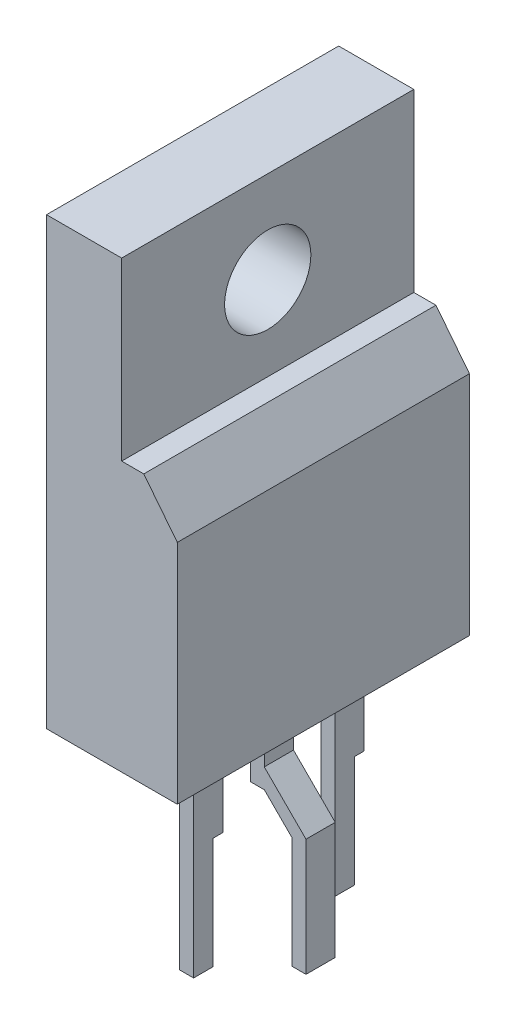
ISO-10303-21;
HEADER;
FILE_DESCRIPTION(('STEP AP214'),'2;1');
FILE_NAME('part.step','',(''),(''),'','','');
FILE_SCHEMA(('AUTOMOTIVE_DESIGN { 1 0 10303 214 1 1 1 1 }'));
ENDSEC;
DATA;
#1=APPLICATION_CONTEXT('core data for automotive mechanical design processes');
#2=APPLICATION_PROTOCOL_DEFINITION('international standard','automotive_design',2000,#1);
#3=PRODUCT_CONTEXT('',#1,'mechanical');
#4=PRODUCT('Part','Part','',(#3));
#5=PRODUCT_RELATED_PRODUCT_CATEGORY('part','',(#4));
#6=PRODUCT_DEFINITION_FORMATION('','',#4);
#7=PRODUCT_DEFINITION_CONTEXT('part definition',#1,'design');
#8=PRODUCT_DEFINITION('design','',#6,#7);
#9=PRODUCT_DEFINITION_SHAPE('','',#8);
#10=(LENGTH_UNIT() NAMED_UNIT(*) SI_UNIT(.MILLI.,.METRE.));
#11=(NAMED_UNIT(*) PLANE_ANGLE_UNIT() SI_UNIT($,.RADIAN.));
#12=(NAMED_UNIT(*) SI_UNIT($,.STERADIAN.) SOLID_ANGLE_UNIT());
#13=UNCERTAINTY_MEASURE_WITH_UNIT(LENGTH_MEASURE(1.E-05),#10,'distance_accuracy_value','');
#14=(GEOMETRIC_REPRESENTATION_CONTEXT(3) GLOBAL_UNCERTAINTY_ASSIGNED_CONTEXT((#13)) GLOBAL_UNIT_ASSIGNED_CONTEXT((#10,
#11,#12)) REPRESENTATION_CONTEXT('',''));
#15=CARTESIAN_POINT('',(0.,0.,0.));
#16=DIRECTION('',(0.,0.,1.));
#17=DIRECTION('',(1.,0.,0.));
#18=AXIS2_PLACEMENT_3D('',#15,#16,#17);
#19=CARTESIAN_POINT('',(3.1,0.,0.));
#20=DIRECTION('',(-1.,0.,0.));
#21=DIRECTION('',(0.,0.,1.));
#22=AXIS2_PLACEMENT_3D('',#19,#20,#21);
#23=PLANE('',#22);
#24=DIRECTION('',(0.,0.,-1.));
#25=VECTOR('',#24,1.);
#26=CARTESIAN_POINT('',(3.1,-23.3,2.53));
#27=LINE('',#26,#25);
#28=CARTESIAN_POINT('',(3.1,-23.3,2.53));
#29=VERTEX_POINT('',#28);
#30=CARTESIAN_POINT('',(3.1,-23.3,3.235));
#31=VERTEX_POINT('',#30);
#32=EDGE_CURVE('E303',#29,#31,#27,.F.);
#33=ORIENTED_EDGE('',*,*,#32,.F.);
#34=DIRECTION('',(0.,1.,0.));
#35=VECTOR('',#34,1.);
#36=CARTESIAN_POINT('',(3.1,-19.3,2.53));
#37=LINE('',#36,#35);
#38=CARTESIAN_POINT('',(3.1,-19.3,2.53));
#39=VERTEX_POINT('',#38);
#40=EDGE_CURVE('E308',#39,#29,#37,.F.);
#41=ORIENTED_EDGE('',*,*,#40,.F.);
#42=DIRECTION('',(0.,0.,-1.));
#43=VECTOR('',#42,1.);
#44=CARTESIAN_POINT('',(3.1,-19.3,2.185));
#45=LINE('',#44,#43);
#46=CARTESIAN_POINT('',(3.1,-19.3,2.185));
#47=VERTEX_POINT('',#46);
#48=EDGE_CURVE('E224',#47,#39,#45,.F.);
#49=ORIENTED_EDGE('',*,*,#48,.F.);
#50=DIRECTION('',(0.,1.,0.));
#51=VECTOR('',#50,1.);
#52=CARTESIAN_POINT('',(3.1,-16.,2.185));
#53=LINE('',#52,#51);
#54=CARTESIAN_POINT('',(3.1,-16.,2.185));
#55=VERTEX_POINT('',#54);
#56=EDGE_CURVE('E205',#55,#47,#53,.F.);
#57=ORIENTED_EDGE('',*,*,#56,.F.);
#58=DIRECTION('',(0.,0.,1.));
#59=VECTOR('',#58,1.);
#60=CARTESIAN_POINT('',(3.1,-16.,0.));
#61=LINE('',#60,#59);
#62=CARTESIAN_POINT('',(3.1,-16.,3.235));
#63=VERTEX_POINT('',#62);
#64=EDGE_CURVE('E210',#63,#55,#61,.F.);
#65=ORIENTED_EDGE('',*,*,#64,.F.);
#66=DIRECTION('',(0.,1.,0.));
#67=VECTOR('',#66,1.);
#68=CARTESIAN_POINT('',(3.1,-23.3,3.235));
#69=LINE('',#68,#67);
#70=EDGE_CURVE('E298',#31,#63,#69,.T.);
#71=ORIENTED_EDGE('',*,*,#70,.F.);
#72=EDGE_LOOP('',(#33,#41,#49,#57,#65,#71));
#73=FACE_BOUND('',#72,.T.);
#74=ADVANCED_FACE('F17',(#73),#23,.F.);
#75=CARTESIAN_POINT('',(3.1,0.,0.));
#76=DIRECTION('',(-1.,0.,0.));
#77=DIRECTION('',(0.,0.,1.));
#78=AXIS2_PLACEMENT_3D('',#75,#76,#77);
#79=PLANE('',#78);
#80=DIRECTION('',(0.,0.,1.));
#81=VECTOR('',#80,1.);
#82=CARTESIAN_POINT('',(3.1,-16.,0.));
#83=LINE('',#82,#81);
#84=CARTESIAN_POINT('',(3.1,-16.,5.775));
#85=VERTEX_POINT('',#84);
#86=CARTESIAN_POINT('',(3.1,-16.,4.725));
#87=VERTEX_POINT('',#86);
#88=EDGE_CURVE('E220',#85,#87,#83,.F.);
#89=ORIENTED_EDGE('',*,*,#88,.F.);
#90=DIRECTION('',(0.,1.,0.));
#91=VECTOR('',#90,1.);
#92=CARTESIAN_POINT('',(3.1,-23.3,5.775));
#93=LINE('',#92,#91);
#94=CARTESIAN_POINT('',(3.10000000000005,-17.9999999999999,5.775));
#95=VERTEX_POINT('',#94);
#96=EDGE_CURVE('E274',#95,#85,#93,.T.);
#97=ORIENTED_EDGE('',*,*,#96,.F.);
#98=DIRECTION('',(0.,0.,1.));
#99=VECTOR('',#98,1.);
#100=CARTESIAN_POINT('',(3.10000000000011,-17.9999999999999,5.775));
#101=LINE('',#100,#99);
#102=CARTESIAN_POINT('',(3.10000000000003,-18.,4.725));
#103=VERTEX_POINT('',#102);
#104=EDGE_CURVE('E248',#103,#95,#101,.T.);
#105=ORIENTED_EDGE('',*,*,#104,.F.);
#106=DIRECTION('',(0.,1.,0.));
#107=VECTOR('',#106,1.);
#108=CARTESIAN_POINT('',(3.1,-16.,4.725));
#109=LINE('',#108,#107);
#110=EDGE_CURVE('E262',#87,#103,#109,.F.);
#111=ORIENTED_EDGE('',*,*,#110,.F.);
#112=EDGE_LOOP('',(#89,#97,#105,#111));
#113=FACE_BOUND('',#112,.T.);
#114=ADVANCED_FACE('F263',(#113),#79,.F.);
#115=CARTESIAN_POINT('',(4.6,-19.5,5.775));
#116=DIRECTION('',(0.707106781186598,0.707106781186498,0.));
#117=DIRECTION('',(-0.707106781186498,0.707106781186598,0.));
#118=AXIS2_PLACEMENT_3D('',#115,#116,#117);
#119=PLANE('',#118);
#120=DIRECTION('',(0.707106781186548,-0.707106781186547,0.));
#121=VECTOR('',#120,1.);
#122=CARTESIAN_POINT('',(3.1,-18.,4.725));
#123=LINE('',#122,#121);
#124=CARTESIAN_POINT('',(4.6,-19.5,4.725));
#125=VERTEX_POINT('',#124);
#126=EDGE_CURVE('E267',#103,#125,#123,.T.);
#127=ORIENTED_EDGE('',*,*,#126,.F.);
#128=ORIENTED_EDGE('',*,*,#104,.T.);
#129=DIRECTION('',(-0.707106781186548,0.707106781186547,0.));
#130=VECTOR('',#129,1.);
#131=CARTESIAN_POINT('',(4.6,-19.5,5.775));
#132=LINE('',#131,#130);
#133=CARTESIAN_POINT('',(4.6,-19.5,5.775));
#134=VERTEX_POINT('',#133);
#135=EDGE_CURVE('E279',#134,#95,#132,.T.);
#136=ORIENTED_EDGE('',*,*,#135,.F.);
#137=DIRECTION('',(0.,0.,-1.));
#138=VECTOR('',#137,1.);
#139=CARTESIAN_POINT('',(4.6,-19.5,5.775));
#140=LINE('',#139,#138);
#141=EDGE_CURVE('E246',#125,#134,#140,.F.);
#142=ORIENTED_EDGE('',*,*,#141,.F.);
#143=EDGE_LOOP('',(#127,#128,#136,#142));
#144=FACE_BOUND('',#143,.T.);
#145=ADVANCED_FACE('F389',(#144),#119,.T.);
#146=CARTESIAN_POINT('',(4.6,-23.70710678119,5.775));
#147=DIRECTION('',(1.,0.,0.));
#148=DIRECTION('',(0.,0.,-1.));
#149=AXIS2_PLACEMENT_3D('',#146,#147,#148);
#150=PLANE('',#149);
#151=ORIENTED_EDGE('',*,*,#141,.T.);
#152=DIRECTION('',(0.,1.,0.));
#153=VECTOR('',#152,1.);
#154=CARTESIAN_POINT('',(4.6,-23.3,5.775));
#155=LINE('',#154,#153);
#156=CARTESIAN_POINT('',(4.6,-23.70710678119,5.775));
#157=VERTEX_POINT('',#156);
#158=EDGE_CURVE('E282',#157,#134,#155,.T.);
#159=ORIENTED_EDGE('',*,*,#158,.F.);
#160=DIRECTION('',(0.,0.,-1.));
#161=VECTOR('',#160,1.);
#162=CARTESIAN_POINT('',(4.6,-23.70710678119,5.775));
#163=LINE('',#162,#161);
#164=CARTESIAN_POINT('',(4.6,-23.70710678119,4.725));
#165=VERTEX_POINT('',#164);
#166=EDGE_CURVE('E244',#165,#157,#163,.F.);
#167=ORIENTED_EDGE('',*,*,#166,.F.);
#168=DIRECTION('',(0.,1.,0.));
#169=VECTOR('',#168,1.);
#170=CARTESIAN_POINT('',(4.6,-16.,4.725));
#171=LINE('',#170,#169);
#172=EDGE_CURVE('E385',#125,#165,#171,.F.);
#173=ORIENTED_EDGE('',*,*,#172,.F.);
#174=EDGE_LOOP('',(#151,#159,#167,#173));
#175=FACE_BOUND('',#174,.T.);
#176=ADVANCED_FACE('F393',(#175),#150,.T.);
#177=CARTESIAN_POINT('',(4.1,-23.70710678119,5.775));
#178=DIRECTION('',(0.,-1.,0.));
#179=DIRECTION('',(0.,0.,-1.));
#180=AXIS2_PLACEMENT_3D('',#177,#178,#179);
#181=PLANE('',#180);
#182=ORIENTED_EDGE('',*,*,#166,.T.);
#183=DIRECTION('',(1.,0.,0.));
#184=VECTOR('',#183,1.);
#185=CARTESIAN_POINT('',(2.6,-23.70710678119,5.775));
#186=LINE('',#185,#184);
#187=CARTESIAN_POINT('',(4.1,-23.70710678119,5.775));
#188=VERTEX_POINT('',#187);
#189=EDGE_CURVE('E285',#188,#157,#186,.T.);
#190=ORIENTED_EDGE('',*,*,#189,.F.);
#191=DIRECTION('',(0.,0.,1.));
#192=VECTOR('',#191,1.);
#193=CARTESIAN_POINT('',(4.1,-23.70710678119,5.775));
#194=LINE('',#193,#192);
#195=CARTESIAN_POINT('',(4.1,-23.70710678119,4.725));
#196=VERTEX_POINT('',#195);
#197=EDGE_CURVE('E242',#196,#188,#194,.T.);
#198=ORIENTED_EDGE('',*,*,#197,.F.);
#199=DIRECTION('',(-1.,0.,0.));
#200=VECTOR('',#199,1.);
#201=CARTESIAN_POINT('',(2.6,-23.70710678119,4.725));
#202=LINE('',#201,#200);
#203=EDGE_CURVE('E382',#165,#196,#202,.T.);
#204=ORIENTED_EDGE('',*,*,#203,.F.);
#205=EDGE_LOOP('',(#182,#190,#198,#204));
#206=FACE_BOUND('',#205,.T.);
#207=ADVANCED_FACE('F397',(#206),#181,.T.);
#208=CARTESIAN_POINT('',(4.1,-19.70710678119,5.775));
#209=DIRECTION('',(-1.,0.,0.));
#210=DIRECTION('',(0.,0.,1.));
#211=AXIS2_PLACEMENT_3D('',#208,#209,#210);
#212=PLANE('',#211);
#213=ORIENTED_EDGE('',*,*,#197,.T.);
#214=DIRECTION('',(0.,1.,0.));
#215=VECTOR('',#214,1.);
#216=CARTESIAN_POINT('',(4.1,-23.3,5.775));
#217=LINE('',#216,#215);
#218=CARTESIAN_POINT('',(4.09999999999995,-19.7071067811901,5.775));
#219=VERTEX_POINT('',#218);
#220=EDGE_CURVE('E288',#219,#188,#217,.F.);
#221=ORIENTED_EDGE('',*,*,#220,.F.);
#222=DIRECTION('',(0.,0.,1.));
#223=VECTOR('',#222,1.);
#224=CARTESIAN_POINT('',(4.09999999999989,-19.7071067811901,5.775));
#225=LINE('',#224,#223);
#226=CARTESIAN_POINT('',(4.09999999999997,-19.70710678119,4.725));
#227=VERTEX_POINT('',#226);
#228=EDGE_CURVE('E240',#227,#219,#225,.T.);
#229=ORIENTED_EDGE('',*,*,#228,.F.);
#230=DIRECTION('',(0.,1.,0.));
#231=VECTOR('',#230,1.);
#232=CARTESIAN_POINT('',(4.1,-16.,4.725));
#233=LINE('',#232,#231);
#234=EDGE_CURVE('E379',#196,#227,#233,.T.);
#235=ORIENTED_EDGE('',*,*,#234,.F.);
#236=EDGE_LOOP('',(#213,#221,#229,#235));
#237=FACE_BOUND('',#236,.T.);
#238=ADVANCED_FACE('F401',(#237),#212,.T.);
#239=CARTESIAN_POINT('',(2.6,-18.20710678119,5.775));
#240=DIRECTION('',(-0.707106781186598,-0.707106781186498,0.));
#241=DIRECTION('',(0.707106781186498,-0.707106781186598,0.));
#242=AXIS2_PLACEMENT_3D('',#239,#240,#241);
#243=PLANE('',#242);
#244=DIRECTION('',(0.707106781186547,-0.707106781186548,0.));
#245=VECTOR('',#244,1.);
#246=CARTESIAN_POINT('',(3.1,-18.70710678119,5.775));
#247=LINE('',#246,#245);
#248=CARTESIAN_POINT('',(3.09999999999999,-18.70710678119,5.775));
#249=VERTEX_POINT('',#248);
#250=EDGE_CURVE('E291',#249,#219,#247,.T.);
#251=ORIENTED_EDGE('',*,*,#250,.F.);
#252=DIRECTION('',(0.,0.,1.));
#253=VECTOR('',#252,1.);
#254=CARTESIAN_POINT('',(3.1,-18.70710678119,0.));
#255=LINE('',#254,#253);
#256=CARTESIAN_POINT('',(3.09999999999998,-18.70710678119,4.725));
#257=VERTEX_POINT('',#256);
#258=EDGE_CURVE('E238',#249,#257,#255,.F.);
#259=ORIENTED_EDGE('',*,*,#258,.T.);
#260=DIRECTION('',(-0.707106781186547,0.707106781186548,0.));
#261=VECTOR('',#260,1.);
#262=CARTESIAN_POINT('',(4.1,-19.70710678119,4.725));
#263=LINE('',#262,#261);
#264=EDGE_CURVE('E376',#227,#257,#263,.T.);
#265=ORIENTED_EDGE('',*,*,#264,.F.);
#266=ORIENTED_EDGE('',*,*,#228,.T.);
#267=EDGE_LOOP('',(#251,#259,#265,#266));
#268=FACE_BOUND('',#267,.T.);
#269=ADVANCED_FACE('F405',(#268),#243,.T.);
#270=CARTESIAN_POINT('',(3.1,0.,0.));
#271=DIRECTION('',(-1.,0.,0.));
#272=DIRECTION('',(0.,0.,1.));
#273=AXIS2_PLACEMENT_3D('',#270,#271,#272);
#274=PLANE('',#273);
#275=ORIENTED_EDGE('',*,*,#258,.F.);
#276=DIRECTION('',(0.,1.,0.));
#277=VECTOR('',#276,1.);
#278=CARTESIAN_POINT('',(3.1,-23.3,5.775));
#279=LINE('',#278,#277);
#280=CARTESIAN_POINT('',(3.1,-18.71,5.775));
#281=VERTEX_POINT('',#280);
#282=EDGE_CURVE('E294',#281,#249,#279,.T.);
#283=ORIENTED_EDGE('',*,*,#282,.F.);
#284=DIRECTION('',(0.,0.,-1.));
#285=VECTOR('',#284,1.);
#286=CARTESIAN_POINT('',(3.1,-18.71,0.));
#287=LINE('',#286,#285);
#288=CARTESIAN_POINT('',(3.1,-18.71,4.725));
#289=VERTEX_POINT('',#288);
#290=EDGE_CURVE('E365',#289,#281,#287,.F.);
#291=ORIENTED_EDGE('',*,*,#290,.F.);
#292=DIRECTION('',(0.,1.,0.));
#293=VECTOR('',#292,1.);
#294=CARTESIAN_POINT('',(3.1,-16.,4.725));
#295=LINE('',#294,#293);
#296=EDGE_CURVE('E374',#257,#289,#295,.F.);
#297=ORIENTED_EDGE('',*,*,#296,.F.);
#298=EDGE_LOOP('',(#275,#283,#291,#297));
#299=FACE_BOUND('',#298,.T.);
#300=ADVANCED_FACE('F409',(#299),#274,.F.);
#301=CARTESIAN_POINT('',(3.1,0.,0.));
#302=DIRECTION('',(-1.,0.,0.));
#303=DIRECTION('',(0.,0.,1.));
#304=AXIS2_PLACEMENT_3D('',#301,#302,#303);
#305=PLANE('',#304);
#306=DIRECTION('',(0.,0.,-1.));
#307=VECTOR('',#306,1.);
#308=CARTESIAN_POINT('',(3.1,-23.3,7.61));
#309=LINE('',#308,#307);
#310=CARTESIAN_POINT('',(3.1,-23.3,7.61));
#311=VERTEX_POINT('',#310);
#312=CARTESIAN_POINT('',(3.1,-23.3,8.315));
#313=VERTEX_POINT('',#312);
#314=EDGE_CURVE('E345',#311,#313,#309,.F.);
#315=ORIENTED_EDGE('',*,*,#314,.F.);
#316=DIRECTION('',(0.,1.,0.));
#317=VECTOR('',#316,1.);
#318=CARTESIAN_POINT('',(3.1,-19.3,7.61));
#319=LINE('',#318,#317);
#320=CARTESIAN_POINT('',(3.1,-19.3,7.61));
#321=VERTEX_POINT('',#320);
#322=EDGE_CURVE('E350',#321,#311,#319,.F.);
#323=ORIENTED_EDGE('',*,*,#322,.F.);
#324=DIRECTION('',(0.,0.,-1.));
#325=VECTOR('',#324,1.);
#326=CARTESIAN_POINT('',(3.1,-19.3,7.265));
#327=LINE('',#326,#325);
#328=CARTESIAN_POINT('',(3.1,-19.3,7.265));
#329=VERTEX_POINT('',#328);
#330=EDGE_CURVE('E355',#329,#321,#327,.F.);
#331=ORIENTED_EDGE('',*,*,#330,.F.);
#332=DIRECTION('',(0.,1.,0.));
#333=VECTOR('',#332,1.);
#334=CARTESIAN_POINT('',(3.1,-16.,7.265));
#335=LINE('',#334,#333);
#336=CARTESIAN_POINT('',(3.1,-16.,7.265));
#337=VERTEX_POINT('',#336);
#338=EDGE_CURVE('E363',#337,#329,#335,.F.);
#339=ORIENTED_EDGE('',*,*,#338,.F.);
#340=DIRECTION('',(0.,0.,1.));
#341=VECTOR('',#340,1.);
#342=CARTESIAN_POINT('',(3.1,-16.,0.));
#343=LINE('',#342,#341);
#344=CARTESIAN_POINT('',(3.1,-16.,8.315));
#345=VERTEX_POINT('',#344);
#346=EDGE_CURVE('E226',#345,#337,#343,.F.);
#347=ORIENTED_EDGE('',*,*,#346,.F.);
#348=DIRECTION('',(0.,1.,0.));
#349=VECTOR('',#348,1.);
#350=CARTESIAN_POINT('',(3.1,-23.3,8.315));
#351=LINE('',#350,#349);
#352=EDGE_CURVE('E339',#313,#345,#351,.T.);
#353=ORIENTED_EDGE('',*,*,#352,.F.);
#354=EDGE_LOOP('',(#315,#323,#331,#339,#347,#353));
#355=FACE_BOUND('',#354,.T.);
#356=ADVANCED_FACE('F677',(#355),#305,.F.);
#357=CARTESIAN_POINT('',(2.6,-16.,2.185));
#358=DIRECTION('',(0.,0.,-1.));
#359=DIRECTION('',(-1.,0.,0.));
#360=AXIS2_PLACEMENT_3D('',#357,#358,#359);
#361=PLANE('',#360);
#362=DIRECTION('',(0.,1.,0.));
#363=VECTOR('',#362,1.);
#364=CARTESIAN_POINT('',(2.6,0.,2.185));
#365=LINE('',#364,#363);
#366=CARTESIAN_POINT('',(2.6,-16.,2.185));
#367=VERTEX_POINT('',#366);
#368=CARTESIAN_POINT('',(2.6,-19.3,2.185));
#369=VERTEX_POINT('',#368);
#370=EDGE_CURVE('E230',#367,#369,#365,.F.);
#371=ORIENTED_EDGE('',*,*,#370,.F.);
#372=DIRECTION('',(-1.,0.,0.));
#373=VECTOR('',#372,1.);
#374=CARTESIAN_POINT('',(2.6,-16.,2.185));
#375=LINE('',#374,#373);
#376=EDGE_CURVE('E214',#367,#55,#375,.F.);
#377=ORIENTED_EDGE('',*,*,#376,.T.);
#378=ORIENTED_EDGE('',*,*,#56,.T.);
#379=DIRECTION('',(1.,0.,0.));
#380=VECTOR('',#379,1.);
#381=CARTESIAN_POINT('',(2.6,-19.3,2.185));
#382=LINE('',#381,#380);
#383=EDGE_CURVE('E232',#369,#47,#382,.T.);
#384=ORIENTED_EDGE('',*,*,#383,.F.);
#385=EDGE_LOOP('',(#371,#377,#378,#384));
#386=FACE_BOUND('',#385,.T.);
#387=ADVANCED_FACE('F228',(#386),#361,.T.);
#388=CARTESIAN_POINT('',(2.6,-19.3,2.185));
#389=DIRECTION('',(0.,-1.,0.));
#390=DIRECTION('',(0.,0.,-1.));
#391=AXIS2_PLACEMENT_3D('',#388,#389,#390);
#392=PLANE('',#391);
#393=DIRECTION('',(-1.,0.,0.));
#394=VECTOR('',#393,1.);
#395=CARTESIAN_POINT('',(2.6,-19.3,2.53));
#396=LINE('',#395,#394);
#397=CARTESIAN_POINT('',(2.6,-19.3,2.53));
#398=VERTEX_POINT('',#397);
#399=EDGE_CURVE('E310',#398,#39,#396,.F.);
#400=ORIENTED_EDGE('',*,*,#399,.F.);
#401=DIRECTION('',(0.,0.,1.));
#402=VECTOR('',#401,1.);
#403=CARTESIAN_POINT('',(2.6,-19.3,0.));
#404=LINE('',#403,#402);
#405=EDGE_CURVE('E325',#369,#398,#404,.T.);
#406=ORIENTED_EDGE('',*,*,#405,.F.);
#407=ORIENTED_EDGE('',*,*,#383,.T.);
#408=ORIENTED_EDGE('',*,*,#48,.T.);
#409=EDGE_LOOP('',(#400,#406,#407,#408));
#410=FACE_BOUND('',#409,.T.);
#411=ADVANCED_FACE('F313',(#410),#392,.T.);
#412=CARTESIAN_POINT('',(2.6,-19.3,2.53));
#413=DIRECTION('',(0.,0.,-1.));
#414=DIRECTION('',(-1.,0.,0.));
#415=AXIS2_PLACEMENT_3D('',#412,#413,#414);
#416=PLANE('',#415);
#417=DIRECTION('',(1.,0.,0.));
#418=VECTOR('',#417,1.);
#419=CARTESIAN_POINT('',(2.6,-23.3,2.53));
#420=LINE('',#419,#418);
#421=CARTESIAN_POINT('',(2.6,-23.3,2.53));
#422=VERTEX_POINT('',#421);
#423=EDGE_CURVE('E305',#422,#29,#420,.T.);
#424=ORIENTED_EDGE('',*,*,#423,.F.);
#425=DIRECTION('',(0.,1.,0.));
#426=VECTOR('',#425,1.);
#427=CARTESIAN_POINT('',(2.6,0.,2.53));
#428=LINE('',#427,#426);
#429=EDGE_CURVE('E319',#398,#422,#428,.F.);
#430=ORIENTED_EDGE('',*,*,#429,.F.);
#431=ORIENTED_EDGE('',*,*,#399,.T.);
#432=ORIENTED_EDGE('',*,*,#40,.T.);
#433=EDGE_LOOP('',(#424,#430,#431,#432));
#434=FACE_BOUND('',#433,.T.);
#435=ADVANCED_FACE('F317',(#434),#416,.T.);
#436=CARTESIAN_POINT('',(2.6,-23.3,2.53));
#437=DIRECTION('',(0.,-1.,0.));
#438=DIRECTION('',(0.,0.,-1.));
#439=AXIS2_PLACEMENT_3D('',#436,#437,#438);
#440=PLANE('',#439);
#441=DIRECTION('',(1.,0.,0.));
#442=VECTOR('',#441,1.);
#443=CARTESIAN_POINT('',(2.6,-23.3,3.235));
#444=LINE('',#443,#442);
#445=CARTESIAN_POINT('',(2.6,-23.3,3.235));
#446=VERTEX_POINT('',#445);
#447=EDGE_CURVE('E300',#446,#31,#444,.T.);
#448=ORIENTED_EDGE('',*,*,#447,.F.);
#449=DIRECTION('',(0.,0.,1.));
#450=VECTOR('',#449,1.);
#451=CARTESIAN_POINT('',(2.6,-23.3,0.));
#452=LINE('',#451,#450);
#453=EDGE_CURVE('E324',#422,#446,#452,.T.);
#454=ORIENTED_EDGE('',*,*,#453,.F.);
#455=ORIENTED_EDGE('',*,*,#423,.T.);
#456=ORIENTED_EDGE('',*,*,#32,.T.);
#457=EDGE_LOOP('',(#448,#454,#455,#456));
#458=FACE_BOUND('',#457,.T.);
#459=ADVANCED_FACE('F430',(#458),#440,.T.);
#460=CARTESIAN_POINT('',(2.6,-23.3,3.235));
#461=DIRECTION('',(0.,0.,1.));
#462=DIRECTION('',(1.,0.,0.));
#463=AXIS2_PLACEMENT_3D('',#460,#461,#462);
#464=PLANE('',#463);
#465=DIRECTION('',(1.,0.,0.));
#466=VECTOR('',#465,1.);
#467=CARTESIAN_POINT('',(2.6,-16.,3.235));
#468=LINE('',#467,#466);
#469=CARTESIAN_POINT('',(2.6,-16.,3.235));
#470=VERTEX_POINT('',#469);
#471=EDGE_CURVE('E216',#63,#470,#468,.F.);
#472=ORIENTED_EDGE('',*,*,#471,.T.);
#473=DIRECTION('',(0.,1.,0.));
#474=VECTOR('',#473,1.);
#475=CARTESIAN_POINT('',(2.6,0.,3.235));
#476=LINE('',#475,#474);
#477=EDGE_CURVE('E424',#446,#470,#476,.T.);
#478=ORIENTED_EDGE('',*,*,#477,.F.);
#479=ORIENTED_EDGE('',*,*,#447,.T.);
#480=ORIENTED_EDGE('',*,*,#70,.T.);
#481=EDGE_LOOP('',(#472,#478,#479,#480));
#482=FACE_BOUND('',#481,.T.);
#483=ADVANCED_FACE('F432',(#482),#464,.T.);
#484=CARTESIAN_POINT('',(2.6,-23.3,5.775));
#485=DIRECTION('',(0.,0.,1.));
#486=DIRECTION('',(1.,0.,0.));
#487=AXIS2_PLACEMENT_3D('',#484,#485,#486);
#488=PLANE('',#487);
#489=DIRECTION('',(0.,1.,0.));
#490=VECTOR('',#489,1.);
#491=CARTESIAN_POINT('',(2.6,0.,5.775));
#492=LINE('',#491,#490);
#493=CARTESIAN_POINT('',(2.6,-18.71,5.775));
#494=VERTEX_POINT('',#493);
#495=CARTESIAN_POINT('',(2.6,-16.,5.775));
#496=VERTEX_POINT('',#495);
#497=EDGE_CURVE('E422',#494,#496,#492,.T.);
#498=ORIENTED_EDGE('',*,*,#497,.F.);
#499=DIRECTION('',(1.,0.,0.));
#500=VECTOR('',#499,1.);
#501=CARTESIAN_POINT('',(2.6,-18.71,5.775));
#502=LINE('',#501,#500);
#503=EDGE_CURVE('E371',#281,#494,#502,.F.);
#504=ORIENTED_EDGE('',*,*,#503,.F.);
#505=ORIENTED_EDGE('',*,*,#282,.T.);
#506=ORIENTED_EDGE('',*,*,#250,.T.);
#507=ORIENTED_EDGE('',*,*,#220,.T.);
#508=ORIENTED_EDGE('',*,*,#189,.T.);
#509=ORIENTED_EDGE('',*,*,#158,.T.);
#510=ORIENTED_EDGE('',*,*,#135,.T.);
#511=ORIENTED_EDGE('',*,*,#96,.T.);
#512=DIRECTION('',(1.,0.,0.));
#513=VECTOR('',#512,1.);
#514=CARTESIAN_POINT('',(2.6,-16.,5.775));
#515=LINE('',#514,#513);
#516=EDGE_CURVE('E257',#85,#496,#515,.F.);
#517=ORIENTED_EDGE('',*,*,#516,.T.);
#518=EDGE_LOOP('',(#498,#504,#505,#506,#507,#508,#509,#510,#511,#517));
#519=FACE_BOUND('',#518,.T.);
#520=ADVANCED_FACE('F434',(#519),#488,.T.);
#521=CARTESIAN_POINT('',(2.6,-16.,4.725));
#522=DIRECTION('',(0.,0.,-1.));
#523=DIRECTION('',(-1.,0.,0.));
#524=AXIS2_PLACEMENT_3D('',#521,#522,#523);
#525=PLANE('',#524);
#526=ORIENTED_EDGE('',*,*,#296,.T.);
#527=DIRECTION('',(1.,0.,0.));
#528=VECTOR('',#527,1.);
#529=CARTESIAN_POINT('',(2.6,-18.71,4.725));
#530=LINE('',#529,#528);
#531=CARTESIAN_POINT('',(2.6,-18.71,4.725));
#532=VERTEX_POINT('',#531);
#533=EDGE_CURVE('E368',#532,#289,#530,.T.);
#534=ORIENTED_EDGE('',*,*,#533,.F.);
#535=DIRECTION('',(0.,1.,0.));
#536=VECTOR('',#535,1.);
#537=CARTESIAN_POINT('',(2.6,0.,4.725));
#538=LINE('',#537,#536);
#539=CARTESIAN_POINT('',(2.6,-16.,4.725));
#540=VERTEX_POINT('',#539);
#541=EDGE_CURVE('E271',#540,#532,#538,.F.);
#542=ORIENTED_EDGE('',*,*,#541,.F.);
#543=DIRECTION('',(-1.,0.,0.));
#544=VECTOR('',#543,1.);
#545=CARTESIAN_POINT('',(2.6,-16.,4.725));
#546=LINE('',#545,#544);
#547=EDGE_CURVE('E255',#540,#87,#546,.F.);
#548=ORIENTED_EDGE('',*,*,#547,.T.);
#549=ORIENTED_EDGE('',*,*,#110,.T.);
#550=ORIENTED_EDGE('',*,*,#126,.T.);
#551=ORIENTED_EDGE('',*,*,#172,.T.);
#552=ORIENTED_EDGE('',*,*,#203,.T.);
#553=ORIENTED_EDGE('',*,*,#234,.T.);
#554=ORIENTED_EDGE('',*,*,#264,.T.);
#555=EDGE_LOOP('',(#526,#534,#542,#548,#549,#550,#551,#552,#553,#554));
#556=FACE_BOUND('',#555,.T.);
#557=ADVANCED_FACE('F269',(#556),#525,.T.);
#558=CARTESIAN_POINT('',(2.6,-18.71,0.));
#559=DIRECTION('',(0.,-1.,0.));
#560=DIRECTION('',(0.,0.,-1.));
#561=AXIS2_PLACEMENT_3D('',#558,#559,#560);
#562=PLANE('',#561);
#563=ORIENTED_EDGE('',*,*,#533,.T.);
#564=ORIENTED_EDGE('',*,*,#290,.T.);
#565=ORIENTED_EDGE('',*,*,#503,.T.);
#566=DIRECTION('',(0.,0.,1.));
#567=VECTOR('',#566,1.);
#568=CARTESIAN_POINT('',(2.6,-18.71,0.));
#569=LINE('',#568,#567);
#570=EDGE_CURVE('E413',#532,#494,#569,.T.);
#571=ORIENTED_EDGE('',*,*,#570,.F.);
#572=EDGE_LOOP('',(#563,#564,#565,#571));
#573=FACE_BOUND('',#572,.T.);
#574=ADVANCED_FACE('F414',(#573),#562,.T.);
#575=CARTESIAN_POINT('',(2.6,-16.,7.265));
#576=DIRECTION('',(0.,0.,-1.));
#577=DIRECTION('',(-1.,0.,0.));
#578=AXIS2_PLACEMENT_3D('',#575,#576,#577);
#579=PLANE('',#578);
#580=DIRECTION('',(0.,1.,0.));
#581=VECTOR('',#580,1.);
#582=CARTESIAN_POINT('',(2.6,0.,7.265));
#583=LINE('',#582,#581);
#584=CARTESIAN_POINT('',(2.6,-16.,7.265));
#585=VERTEX_POINT('',#584);
#586=CARTESIAN_POINT('',(2.6,-19.3,7.265));
#587=VERTEX_POINT('',#586);
#588=EDGE_CURVE('E418',#585,#587,#583,.F.);
#589=ORIENTED_EDGE('',*,*,#588,.F.);
#590=DIRECTION('',(-1.,0.,0.));
#591=VECTOR('',#590,1.);
#592=CARTESIAN_POINT('',(2.6,-16.,7.265));
#593=LINE('',#592,#591);
#594=EDGE_CURVE('E360',#585,#337,#593,.F.);
#595=ORIENTED_EDGE('',*,*,#594,.T.);
#596=ORIENTED_EDGE('',*,*,#338,.T.);
#597=DIRECTION('',(1.,0.,0.));
#598=VECTOR('',#597,1.);
#599=CARTESIAN_POINT('',(2.6,-19.3,7.265));
#600=LINE('',#599,#598);
#601=EDGE_CURVE('E357',#587,#329,#600,.T.);
#602=ORIENTED_EDGE('',*,*,#601,.F.);
#603=EDGE_LOOP('',(#589,#595,#596,#602));
#604=FACE_BOUND('',#603,.T.);
#605=ADVANCED_FACE('F509',(#604),#579,.T.);
#606=CARTESIAN_POINT('',(2.6,-19.3,7.265));
#607=DIRECTION('',(0.,-1.,0.));
#608=DIRECTION('',(0.,0.,-1.));
#609=AXIS2_PLACEMENT_3D('',#606,#607,#608);
#610=PLANE('',#609);
#611=DIRECTION('',(-1.,0.,0.));
#612=VECTOR('',#611,1.);
#613=CARTESIAN_POINT('',(2.6,-19.3,7.61));
#614=LINE('',#613,#612);
#615=CARTESIAN_POINT('',(2.6,-19.3,7.61));
#616=VERTEX_POINT('',#615);
#617=EDGE_CURVE('E352',#616,#321,#614,.F.);
#618=ORIENTED_EDGE('',*,*,#617,.F.);
#619=DIRECTION('',(0.,0.,1.));
#620=VECTOR('',#619,1.);
#621=CARTESIAN_POINT('',(2.6,-19.3,0.));
#622=LINE('',#621,#620);
#623=EDGE_CURVE('E766',#587,#616,#622,.T.);
#624=ORIENTED_EDGE('',*,*,#623,.F.);
#625=ORIENTED_EDGE('',*,*,#601,.T.);
#626=ORIENTED_EDGE('',*,*,#330,.T.);
#627=EDGE_LOOP('',(#618,#624,#625,#626));
#628=FACE_BOUND('',#627,.T.);
#629=ADVANCED_FACE('F505',(#628),#610,.T.);
#630=CARTESIAN_POINT('',(2.6,-19.3,7.61));
#631=DIRECTION('',(0.,0.,-1.));
#632=DIRECTION('',(-1.,0.,0.));
#633=AXIS2_PLACEMENT_3D('',#630,#631,#632);
#634=PLANE('',#633);
#635=DIRECTION('',(1.,0.,0.));
#636=VECTOR('',#635,1.);
#637=CARTESIAN_POINT('',(2.6,-23.3,7.61));
#638=LINE('',#637,#636);
#639=CARTESIAN_POINT('',(2.6,-23.3,7.61));
#640=VERTEX_POINT('',#639);
#641=EDGE_CURVE('E347',#640,#311,#638,.T.);
#642=ORIENTED_EDGE('',*,*,#641,.F.);
#643=DIRECTION('',(0.,1.,0.));
#644=VECTOR('',#643,1.);
#645=CARTESIAN_POINT('',(2.6,0.,7.61));
#646=LINE('',#645,#644);
#647=EDGE_CURVE('E763',#616,#640,#646,.F.);
#648=ORIENTED_EDGE('',*,*,#647,.F.);
#649=ORIENTED_EDGE('',*,*,#617,.T.);
#650=ORIENTED_EDGE('',*,*,#322,.T.);
#651=EDGE_LOOP('',(#642,#648,#649,#650));
#652=FACE_BOUND('',#651,.T.);
#653=ADVANCED_FACE('F501',(#652),#634,.T.);
#654=CARTESIAN_POINT('',(2.6,-23.3,7.61));
#655=DIRECTION('',(0.,-1.,0.));
#656=DIRECTION('',(0.,0.,-1.));
#657=AXIS2_PLACEMENT_3D('',#654,#655,#656);
#658=PLANE('',#657);
#659=DIRECTION('',(1.,0.,0.));
#660=VECTOR('',#659,1.);
#661=CARTESIAN_POINT('',(2.6,-23.3,8.315));
#662=LINE('',#661,#660);
#663=CARTESIAN_POINT('',(2.6,-23.3,8.315));
#664=VERTEX_POINT('',#663);
#665=EDGE_CURVE('E342',#664,#313,#662,.T.);
#666=ORIENTED_EDGE('',*,*,#665,.F.);
#667=DIRECTION('',(0.,0.,1.));
#668=VECTOR('',#667,1.);
#669=CARTESIAN_POINT('',(2.6,-23.3,0.));
#670=LINE('',#669,#668);
#671=EDGE_CURVE('E760',#640,#664,#670,.T.);
#672=ORIENTED_EDGE('',*,*,#671,.F.);
#673=ORIENTED_EDGE('',*,*,#641,.T.);
#674=ORIENTED_EDGE('',*,*,#314,.T.);
#675=EDGE_LOOP('',(#666,#672,#673,#674));
#676=FACE_BOUND('',#675,.T.);
#677=ADVANCED_FACE('F497',(#676),#658,.T.);
#678=CARTESIAN_POINT('',(2.6,-23.3,8.315));
#679=DIRECTION('',(0.,0.,1.));
#680=DIRECTION('',(1.,0.,0.));
#681=AXIS2_PLACEMENT_3D('',#678,#679,#680);
#682=PLANE('',#681);
#683=DIRECTION('',(1.,0.,0.));
#684=VECTOR('',#683,1.);
#685=CARTESIAN_POINT('',(2.6,-16.,8.315));
#686=LINE('',#685,#684);
#687=CARTESIAN_POINT('',(2.6,-16.,8.315));
#688=VERTEX_POINT('',#687);
#689=EDGE_CURVE('E337',#345,#688,#686,.F.);
#690=ORIENTED_EDGE('',*,*,#689,.T.);
#691=DIRECTION('',(0.,1.,0.));
#692=VECTOR('',#691,1.);
#693=CARTESIAN_POINT('',(2.6,0.,8.315));
#694=LINE('',#693,#692);
#695=EDGE_CURVE('E776',#664,#688,#694,.T.);
#696=ORIENTED_EDGE('',*,*,#695,.F.);
#697=ORIENTED_EDGE('',*,*,#665,.T.);
#698=ORIENTED_EDGE('',*,*,#352,.T.);
#699=EDGE_LOOP('',(#690,#696,#697,#698));
#700=FACE_BOUND('',#699,.T.);
#701=ADVANCED_FACE('F493',(#700),#682,.T.);
#702=CARTESIAN_POINT('',(3.49510073942,-6.32,10.5));
#703=DIRECTION('',(0.,1.,0.));
#704=DIRECTION('',(0.,0.,1.));
#705=AXIS2_PLACEMENT_3D('',#702,#703,#704);
#706=PLANE('',#705);
#707=DIRECTION('',(1.,0.,0.));
#708=VECTOR('',#707,1.);
#709=CARTESIAN_POINT('',(3.49510073942,-6.32,0.));
#710=LINE('',#709,#708);
#711=CARTESIAN_POINT('',(3.49510073941989,-6.32000000000009,0.));
#712=VERTEX_POINT('',#711);
#713=CARTESIAN_POINT('',(2.7,-6.32,0.));
#714=VERTEX_POINT('',#713);
#715=EDGE_CURVE('E330',#712,#714,#710,.F.);
#716=ORIENTED_EDGE('',*,*,#715,.T.);
#717=DIRECTION('',(0.,0.,-1.));
#718=VECTOR('',#717,1.);
#719=CARTESIAN_POINT('',(2.7,-6.32,0.));
#720=LINE('',#719,#718);
#721=CARTESIAN_POINT('',(2.7,-6.32,10.5));
#722=VERTEX_POINT('',#721);
#723=EDGE_CURVE('E795',#722,#714,#720,.T.);
#724=ORIENTED_EDGE('',*,*,#723,.F.);
#725=DIRECTION('',(1.,0.,0.));
#726=VECTOR('',#725,1.);
#727=CARTESIAN_POINT('',(3.49510073942,-6.32,10.5));
#728=LINE('',#727,#726);
#729=CARTESIAN_POINT('',(3.49510073941989,-6.32000000000009,10.5));
#730=VERTEX_POINT('',#729);
#731=EDGE_CURVE('E335',#722,#730,#728,.T.);
#732=ORIENTED_EDGE('',*,*,#731,.T.);
#733=DIRECTION('',(0.,0.,1.));
#734=VECTOR('',#733,1.);
#735=CARTESIAN_POINT('',(3.49510073941955,-6.32000000000035,10.5));
#736=LINE('',#735,#734);
#737=EDGE_CURVE('E798',#712,#730,#736,.T.);
#738=ORIENTED_EDGE('',*,*,#737,.F.);
#739=EDGE_LOOP('',(#716,#724,#732,#738));
#740=FACE_BOUND('',#739,.T.);
#741=ADVANCED_FACE('F490',(#740),#706,.T.);
#742=CARTESIAN_POINT('',(2.6,0.,0.));
#743=DIRECTION('',(-1.,0.,0.));
#744=DIRECTION('',(0.,0.,1.));
#745=AXIS2_PLACEMENT_3D('',#742,#743,#744);
#746=PLANE('',#745);
#747=ORIENTED_EDGE('',*,*,#477,.T.);
#748=DIRECTION('',(0.,0.,-1.));
#749=VECTOR('',#748,1.);
#750=CARTESIAN_POINT('',(2.6,-16.,0.));
#751=LINE('',#750,#749);
#752=EDGE_CURVE('E788',#367,#470,#751,.F.);
#753=ORIENTED_EDGE('',*,*,#752,.F.);
#754=ORIENTED_EDGE('',*,*,#370,.T.);
#755=ORIENTED_EDGE('',*,*,#405,.T.);
#756=ORIENTED_EDGE('',*,*,#429,.T.);
#757=ORIENTED_EDGE('',*,*,#453,.T.);
#758=EDGE_LOOP('',(#747,#753,#754,#755,#756,#757));
#759=FACE_BOUND('',#758,.T.);
#760=ADVANCED_FACE('F328',(#759),#746,.T.);
#761=CARTESIAN_POINT('',(2.6,0.,0.));
#762=DIRECTION('',(-1.,0.,0.));
#763=DIRECTION('',(0.,0.,1.));
#764=AXIS2_PLACEMENT_3D('',#761,#762,#763);
#765=PLANE('',#764);
#766=ORIENTED_EDGE('',*,*,#541,.T.);
#767=ORIENTED_EDGE('',*,*,#570,.T.);
#768=ORIENTED_EDGE('',*,*,#497,.T.);
#769=DIRECTION('',(0.,0.,-1.));
#770=VECTOR('',#769,1.);
#771=CARTESIAN_POINT('',(2.6,-16.,0.));
#772=LINE('',#771,#770);
#773=EDGE_CURVE('E421',#540,#496,#772,.F.);
#774=ORIENTED_EDGE('',*,*,#773,.F.);
#775=EDGE_LOOP('',(#766,#767,#768,#774));
#776=FACE_BOUND('',#775,.T.);
#777=ADVANCED_FACE('F420',(#776),#765,.T.);
#778=CARTESIAN_POINT('',(2.6,0.,0.));
#779=DIRECTION('',(-1.,0.,0.));
#780=DIRECTION('',(0.,0.,1.));
#781=AXIS2_PLACEMENT_3D('',#778,#779,#780);
#782=PLANE('',#781);
#783=ORIENTED_EDGE('',*,*,#695,.T.);
#784=DIRECTION('',(0.,0.,-1.));
#785=VECTOR('',#784,1.);
#786=CARTESIAN_POINT('',(2.6,-16.,0.));
#787=LINE('',#786,#785);
#788=EDGE_CURVE('E773',#585,#688,#787,.F.);
#789=ORIENTED_EDGE('',*,*,#788,.F.);
#790=ORIENTED_EDGE('',*,*,#588,.T.);
#791=ORIENTED_EDGE('',*,*,#623,.T.);
#792=ORIENTED_EDGE('',*,*,#647,.T.);
#793=ORIENTED_EDGE('',*,*,#671,.T.);
#794=EDGE_LOOP('',(#783,#789,#790,#791,#792,#793));
#795=FACE_BOUND('',#794,.T.);
#796=ADVANCED_FACE('F481',(#795),#782,.T.);
#797=CARTESIAN_POINT('',(4.7,-16.,10.5));
#798=DIRECTION('',(1.,0.,0.));
#799=DIRECTION('',(0.,0.,-1.));
#800=AXIS2_PLACEMENT_3D('',#797,#798,#799);
#801=PLANE('',#800);
#802=DIRECTION('',(0.,0.,1.));
#803=VECTOR('',#802,1.);
#804=CARTESIAN_POINT('',(4.7,-7.849516031556,10.5));
#805=LINE('',#804,#803);
#806=CARTESIAN_POINT('',(4.7,-7.849516031556,10.5));
#807=VERTEX_POINT('',#806);
#808=CARTESIAN_POINT('',(4.7,-7.849516031556,0.));
#809=VERTEX_POINT('',#808);
#810=EDGE_CURVE('E777',#807,#809,#805,.F.);
#811=ORIENTED_EDGE('',*,*,#810,.F.);
#812=DIRECTION('',(0.,1.,0.));
#813=VECTOR('',#812,1.);
#814=CARTESIAN_POINT('',(4.7,0.,10.5));
#815=LINE('',#814,#813);
#816=CARTESIAN_POINT('',(4.7,-16.,10.5));
#817=VERTEX_POINT('',#816);
#818=EDGE_CURVE('E786',#817,#807,#815,.T.);
#819=ORIENTED_EDGE('',*,*,#818,.F.);
#820=DIRECTION('',(0.,0.,-1.));
#821=VECTOR('',#820,1.);
#822=CARTESIAN_POINT('',(4.7,-16.,0.));
#823=LINE('',#822,#821);
#824=CARTESIAN_POINT('',(4.7,-16.,0.));
#825=VERTEX_POINT('',#824);
#826=EDGE_CURVE('E793',#825,#817,#823,.F.);
#827=ORIENTED_EDGE('',*,*,#826,.F.);
#828=DIRECTION('',(0.,1.,0.));
#829=VECTOR('',#828,1.);
#830=CARTESIAN_POINT('',(4.7,0.,0.));
#831=LINE('',#830,#829);
#832=EDGE_CURVE('E811',#825,#809,#831,.T.);
#833=ORIENTED_EDGE('',*,*,#832,.T.);
#834=EDGE_LOOP('',(#811,#819,#827,#833));
#835=FACE_BOUND('',#834,.T.);
#836=ADVANCED_FACE('F477',(#835),#801,.T.);
#837=CARTESIAN_POINT('',(4.7,-7.849516031556,10.5));
#838=DIRECTION('',(0.785535105759401,0.618817095448701,0.));
#839=DIRECTION('',(-0.618817095448701,0.785535105759401,0.));
#840=AXIS2_PLACEMENT_3D('',#837,#838,#839);
#841=PLANE('',#840);
#842=ORIENTED_EDGE('',*,*,#737,.T.);
#843=DIRECTION('',(-0.61881709544847,0.785535105759583,0.));
#844=VECTOR('',#843,1.);
#845=CARTESIAN_POINT('',(4.7,-7.849516031556,10.5));
#846=LINE('',#845,#844);
#847=EDGE_CURVE('E806',#807,#730,#846,.T.);
#848=ORIENTED_EDGE('',*,*,#847,.F.);
#849=ORIENTED_EDGE('',*,*,#810,.T.);
#850=DIRECTION('',(-0.61881709544847,0.785535105759583,0.));
#851=VECTOR('',#850,1.);
#852=CARTESIAN_POINT('',(4.7,-7.849516031556,0.));
#853=LINE('',#852,#851);
#854=EDGE_CURVE('E804',#809,#712,#853,.T.);
#855=ORIENTED_EDGE('',*,*,#854,.T.);
#856=EDGE_LOOP('',(#842,#848,#849,#855));
#857=FACE_BOUND('',#856,.T.);
#858=ADVANCED_FACE('F473',(#857),#841,.T.);
#859=CARTESIAN_POINT('',(2.7,-16.,0.));
#860=DIRECTION('',(1.,0.,0.));
#861=DIRECTION('',(0.,0.,-1.));
#862=AXIS2_PLACEMENT_3D('',#859,#860,#861);
#863=PLANE('',#862);
#864=CARTESIAN_POINT('',(2.7,-3.3,5.25));
#865=DIRECTION('',(1.,0.,0.));
#866=DIRECTION('',(0.,0.,-1.));
#867=AXIS2_PLACEMENT_3D('',#864,#865,#866);
#868=CIRCLE('',#867,1.55);
#869=CARTESIAN_POINT('',(2.7,-3.3,3.7));
#870=VERTEX_POINT('',#869);
#871=EDGE_CURVE('E20',#870,#870,#868,.F.);
#872=ORIENTED_EDGE('',*,*,#871,.T.);
#873=EDGE_LOOP('',(#872));
#874=FACE_BOUND('',#873,.T.);
#875=DIRECTION('',(0.,1.,0.));
#876=VECTOR('',#875,1.);
#877=CARTESIAN_POINT('',(2.7,0.,10.5));
#878=LINE('',#877,#876);
#879=CARTESIAN_POINT('',(2.7,0.,10.5));
#880=VERTEX_POINT('',#879);
#881=EDGE_CURVE('E828',#722,#880,#878,.T.);
#882=ORIENTED_EDGE('',*,*,#881,.F.);
#883=ORIENTED_EDGE('',*,*,#723,.T.);
#884=DIRECTION('',(0.,1.,0.));
#885=VECTOR('',#884,1.);
#886=CARTESIAN_POINT('',(2.7,0.,0.));
#887=LINE('',#886,#885);
#888=CARTESIAN_POINT('',(2.7,0.,0.));
#889=VERTEX_POINT('',#888);
#890=EDGE_CURVE('E814',#714,#889,#887,.T.);
#891=ORIENTED_EDGE('',*,*,#890,.T.);
#892=DIRECTION('',(0.,0.,1.));
#893=VECTOR('',#892,1.);
#894=CARTESIAN_POINT('',(2.7,0.,0.));
#895=LINE('',#894,#893);
#896=EDGE_CURVE('E823',#880,#889,#895,.F.);
#897=ORIENTED_EDGE('',*,*,#896,.F.);
#898=EDGE_LOOP('',(#882,#883,#891,#897));
#899=FACE_BOUND('',#898,.T.);
#900=ADVANCED_FACE('F469',(#874,#899),#863,.T.);
#901=CARTESIAN_POINT('',(0.,-16.,0.));
#902=DIRECTION('',(0.,-1.,0.));
#903=DIRECTION('',(0.,0.,-1.));
#904=AXIS2_PLACEMENT_3D('',#901,#902,#903);
#905=PLANE('',#904);
#906=ORIENTED_EDGE('',*,*,#594,.F.);
#907=ORIENTED_EDGE('',*,*,#788,.T.);
#908=ORIENTED_EDGE('',*,*,#689,.F.);
#909=ORIENTED_EDGE('',*,*,#346,.T.);
#910=EDGE_LOOP('',(#906,#907,#908,#909));
#911=FACE_BOUND('',#910,.T.);
#912=ORIENTED_EDGE('',*,*,#547,.F.);
#913=ORIENTED_EDGE('',*,*,#773,.T.);
#914=ORIENTED_EDGE('',*,*,#516,.F.);
#915=ORIENTED_EDGE('',*,*,#88,.T.);
#916=EDGE_LOOP('',(#912,#913,#914,#915));
#917=FACE_BOUND('',#916,.T.);
#918=ORIENTED_EDGE('',*,*,#376,.F.);
#919=ORIENTED_EDGE('',*,*,#752,.T.);
#920=ORIENTED_EDGE('',*,*,#471,.F.);
#921=ORIENTED_EDGE('',*,*,#64,.T.);
#922=EDGE_LOOP('',(#918,#919,#920,#921));
#923=FACE_BOUND('',#922,.T.);
#924=ORIENTED_EDGE('',*,*,#826,.T.);
#925=DIRECTION('',(1.,0.,0.));
#926=VECTOR('',#925,1.);
#927=CARTESIAN_POINT('',(0.,-16.,10.5));
#928=LINE('',#927,#926);
#929=CARTESIAN_POINT('',(0.,-16.,10.5));
#930=VERTEX_POINT('',#929);
#931=EDGE_CURVE('E783',#930,#817,#928,.T.);
#932=ORIENTED_EDGE('',*,*,#931,.F.);
#933=DIRECTION('',(0.,0.,1.));
#934=VECTOR('',#933,1.);
#935=CARTESIAN_POINT('',(0.,-16.,0.));
#936=LINE('',#935,#934);
#937=CARTESIAN_POINT('',(0.,-16.,0.));
#938=VERTEX_POINT('',#937);
#939=EDGE_CURVE('E832',#938,#930,#936,.T.);
#940=ORIENTED_EDGE('',*,*,#939,.F.);
#941=DIRECTION('',(1.,0.,0.));
#942=VECTOR('',#941,1.);
#943=CARTESIAN_POINT('',(0.,-16.,0.));
#944=LINE('',#943,#942);
#945=EDGE_CURVE('E817',#938,#825,#944,.T.);
#946=ORIENTED_EDGE('',*,*,#945,.T.);
#947=EDGE_LOOP('',(#924,#932,#940,#946));
#948=FACE_BOUND('',#947,.T.);
#949=ADVANCED_FACE('F211',(#911,#917,#923,#948),#905,.T.);
#950=CARTESIAN_POINT('',(0.,0.,10.5));
#951=DIRECTION('',(0.,0.,1.));
#952=DIRECTION('',(1.,0.,0.));
#953=AXIS2_PLACEMENT_3D('',#950,#951,#952);
#954=PLANE('',#953);
#955=ORIENTED_EDGE('',*,*,#731,.F.);
#956=ORIENTED_EDGE('',*,*,#881,.T.);
#957=DIRECTION('',(1.,0.,0.));
#958=VECTOR('',#957,1.);
#959=CARTESIAN_POINT('',(2.7,0.,10.5));
#960=LINE('',#959,#958);
#961=CARTESIAN_POINT('',(0.,0.,10.5));
#962=VERTEX_POINT('',#961);
#963=EDGE_CURVE('E825',#962,#880,#960,.T.);
#964=ORIENTED_EDGE('',*,*,#963,.F.);
#965=DIRECTION('',(0.,1.,0.));
#966=VECTOR('',#965,1.);
#967=CARTESIAN_POINT('',(0.,0.,10.5));
#968=LINE('',#967,#966);
#969=EDGE_CURVE('E838',#930,#962,#968,.T.);
#970=ORIENTED_EDGE('',*,*,#969,.F.);
#971=ORIENTED_EDGE('',*,*,#931,.T.);
#972=ORIENTED_EDGE('',*,*,#818,.T.);
#973=ORIENTED_EDGE('',*,*,#847,.T.);
#974=EDGE_LOOP('',(#955,#956,#964,#970,#971,#972,#973));
#975=FACE_BOUND('',#974,.T.);
#976=ADVANCED_FACE('F463',(#975),#954,.T.);
#977=CARTESIAN_POINT('',(2.7,0.,0.));
#978=DIRECTION('',(0.,1.,0.));
#979=DIRECTION('',(0.,0.,1.));
#980=AXIS2_PLACEMENT_3D('',#977,#978,#979);
#981=PLANE('',#980);
#982=ORIENTED_EDGE('',*,*,#896,.T.);
#983=DIRECTION('',(1.,0.,0.));
#984=VECTOR('',#983,1.);
#985=CARTESIAN_POINT('',(0.,0.,0.));
#986=LINE('',#985,#984);
#987=CARTESIAN_POINT('',(0.,0.,0.));
#988=VERTEX_POINT('',#987);
#989=EDGE_CURVE('E34',#889,#988,#986,.F.);
#990=ORIENTED_EDGE('',*,*,#989,.T.);
#991=DIRECTION('',(0.,0.,1.));
#992=VECTOR('',#991,1.);
#993=CARTESIAN_POINT('',(0.,0.,0.));
#994=LINE('',#993,#992);
#995=EDGE_CURVE('E836',#962,#988,#994,.F.);
#996=ORIENTED_EDGE('',*,*,#995,.F.);
#997=ORIENTED_EDGE('',*,*,#963,.T.);
#998=EDGE_LOOP('',(#982,#990,#996,#997));
#999=FACE_BOUND('',#998,.T.);
#1000=ADVANCED_FACE('F459',(#999),#981,.T.);
#1001=CARTESIAN_POINT('',(0.,0.,0.));
#1002=DIRECTION('',(0.,0.,1.));
#1003=DIRECTION('',(1.,0.,0.));
#1004=AXIS2_PLACEMENT_3D('',#1001,#1002,#1003);
#1005=PLANE('',#1004);
#1006=ORIENTED_EDGE('',*,*,#989,.F.);
#1007=ORIENTED_EDGE('',*,*,#890,.F.);
#1008=ORIENTED_EDGE('',*,*,#715,.F.);
#1009=ORIENTED_EDGE('',*,*,#854,.F.);
#1010=ORIENTED_EDGE('',*,*,#832,.F.);
#1011=ORIENTED_EDGE('',*,*,#945,.F.);
#1012=DIRECTION('',(0.,1.,0.));
#1013=VECTOR('',#1012,1.);
#1014=CARTESIAN_POINT('',(0.,0.,0.));
#1015=LINE('',#1014,#1013);
#1016=EDGE_CURVE('E26',#988,#938,#1015,.F.);
#1017=ORIENTED_EDGE('',*,*,#1016,.F.);
#1018=EDGE_LOOP('',(#1006,#1007,#1008,#1009,#1010,#1011,#1017));
#1019=FACE_BOUND('',#1018,.T.);
#1020=ADVANCED_FACE('F452',(#1019),#1005,.F.);
#1021=CARTESIAN_POINT('',(2.7,-3.3,5.25));
#1022=DIRECTION('',(1.,0.,0.));
#1023=DIRECTION('',(0.,0.,-1.));
#1024=AXIS2_PLACEMENT_3D('',#1021,#1022,#1023);
#1025=CYLINDRICAL_SURFACE('',#1024,1.55);
#1026=ORIENTED_EDGE('',*,*,#871,.F.);
#1027=EDGE_LOOP('',(#1026));
#1028=FACE_BOUND('',#1027,.T.);
#1029=CARTESIAN_POINT('',(0.,-3.3,5.25));
#1030=DIRECTION('',(1.,0.,0.));
#1031=DIRECTION('',(0.,0.,-1.));
#1032=AXIS2_PLACEMENT_3D('',#1029,#1030,#1031);
#1033=CIRCLE('',#1032,1.55);
#1034=CARTESIAN_POINT('',(0.,-3.3,3.7));
#1035=VERTEX_POINT('',#1034);
#1036=EDGE_CURVE('E11',#1035,#1035,#1033,.T.);
#1037=ORIENTED_EDGE('',*,*,#1036,.F.);
#1038=EDGE_LOOP('',(#1037));
#1039=FACE_BOUND('',#1038,.T.);
#1040=ADVANCED_FACE('F446',(#1028,#1039),#1025,.F.);
#1041=CARTESIAN_POINT('',(0.,0.,0.));
#1042=DIRECTION('',(-1.,0.,0.));
#1043=DIRECTION('',(0.,0.,1.));
#1044=AXIS2_PLACEMENT_3D('',#1041,#1042,#1043);
#1045=PLANE('',#1044);
#1046=ORIENTED_EDGE('',*,*,#1036,.T.);
#1047=EDGE_LOOP('',(#1046));
#1048=FACE_BOUND('',#1047,.T.);
#1049=ORIENTED_EDGE('',*,*,#995,.T.);
#1050=ORIENTED_EDGE('',*,*,#1016,.T.);
#1051=ORIENTED_EDGE('',*,*,#939,.T.);
#1052=ORIENTED_EDGE('',*,*,#969,.T.);
#1053=EDGE_LOOP('',(#1049,#1050,#1051,#1052));
#1054=FACE_BOUND('',#1053,.T.);
#1055=ADVANCED_FACE('F444',(#1048,#1054),#1045,.T.);
#1056=CLOSED_SHELL('',(#74,#114,#145,#176,#207,#238,#269,#300,#356,#387,#411,#435,#459,#483,
#520,#557,#574,#605,#629,#653,#677,#701,#741,#760,#777,#796,#836,#858,#900,#949,#976,#1000,
#1020,#1040,#1055));
#1057=MANIFOLD_SOLID_BREP('B1',#1056);
#1058=ADVANCED_BREP_SHAPE_REPRESENTATION('',(#18,#1057),#14);
#1059=SHAPE_DEFINITION_REPRESENTATION(#9,#1058);
ENDSEC;
END-ISO-10303-21;
